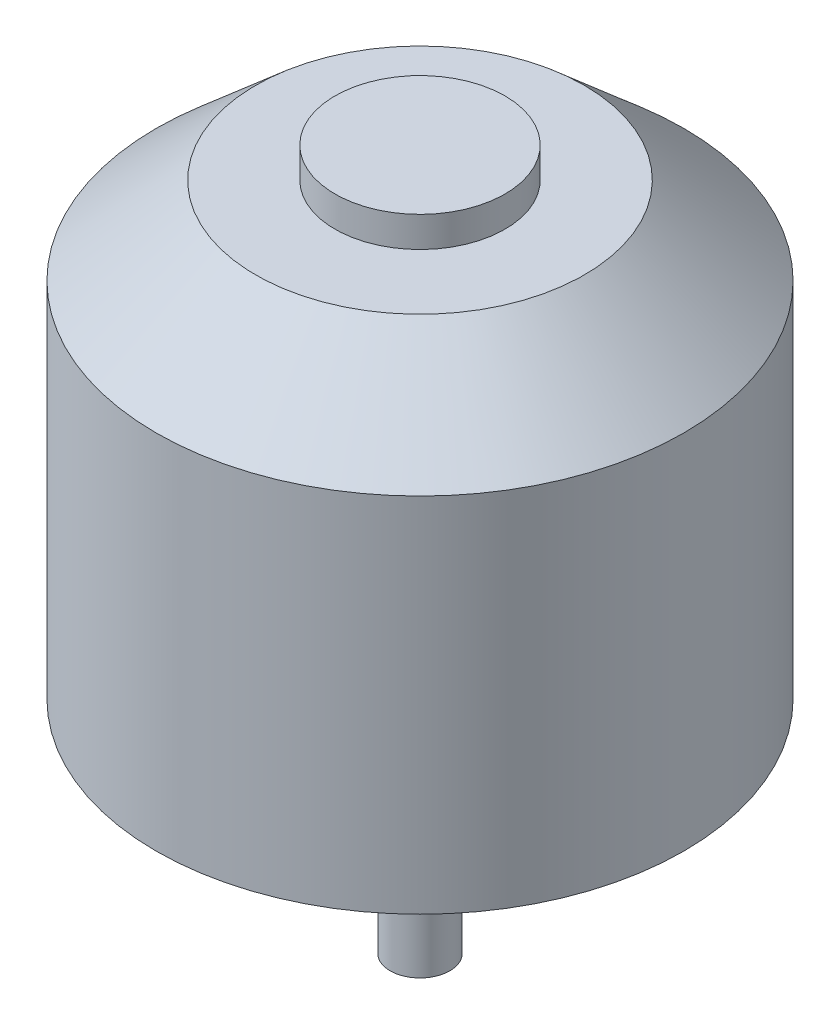
ISO-10303-21;
HEADER;
FILE_DESCRIPTION(('STEP AP214'),'2;1');
FILE_NAME('part.step','',(''),(''),'','','');
FILE_SCHEMA(('AUTOMOTIVE_DESIGN { 1 0 10303 214 1 1 1 1 }'));
ENDSEC;
DATA;
#1=APPLICATION_CONTEXT('core data for automotive mechanical design processes');
#2=APPLICATION_PROTOCOL_DEFINITION('international standard','automotive_design',2000,#1);
#3=PRODUCT_CONTEXT('',#1,'mechanical');
#4=PRODUCT('Part','Part','',(#3));
#5=PRODUCT_RELATED_PRODUCT_CATEGORY('part','',(#4));
#6=PRODUCT_DEFINITION_FORMATION('','',#4);
#7=PRODUCT_DEFINITION_CONTEXT('part definition',#1,'design');
#8=PRODUCT_DEFINITION('design','',#6,#7);
#9=PRODUCT_DEFINITION_SHAPE('','',#8);
#10=(LENGTH_UNIT() NAMED_UNIT(*) SI_UNIT(.MILLI.,.METRE.));
#11=(NAMED_UNIT(*) PLANE_ANGLE_UNIT() SI_UNIT($,.RADIAN.));
#12=(NAMED_UNIT(*) SI_UNIT($,.STERADIAN.) SOLID_ANGLE_UNIT());
#13=UNCERTAINTY_MEASURE_WITH_UNIT(LENGTH_MEASURE(1.E-05),#10,'distance_accuracy_value','');
#14=(GEOMETRIC_REPRESENTATION_CONTEXT(3) GLOBAL_UNCERTAINTY_ASSIGNED_CONTEXT((#13)) GLOBAL_UNIT_ASSIGNED_CONTEXT((#10,
#11,#12)) REPRESENTATION_CONTEXT('',''));
#15=CARTESIAN_POINT('',(0.,0.,0.));
#16=DIRECTION('',(0.,0.,1.));
#17=DIRECTION('',(1.,0.,0.));
#18=AXIS2_PLACEMENT_3D('',#15,#16,#17);
#19=CARTESIAN_POINT('',(0.,0.,0.));
#20=DIRECTION('',(0.,-1.,0.));
#21=DIRECTION('',(0.,0.,-1.));
#22=AXIS2_PLACEMENT_3D('',#19,#20,#21);
#23=PLANE('',#22);
#24=CARTESIAN_POINT('',(8.,0.,0.));
#25=DIRECTION('',(0.,-1.,0.));
#26=DIRECTION('',(0.,0.,-1.));
#27=AXIS2_PLACEMENT_3D('',#24,#25,#26);
#28=CIRCLE('',#27,1.25);
#29=CARTESIAN_POINT('',(8.,0.,-1.25));
#30=VERTEX_POINT('',#29);
#31=EDGE_CURVE('E64',#30,#30,#28,.T.);
#32=ORIENTED_EDGE('',*,*,#31,.F.);
#33=EDGE_LOOP('',(#32));
#34=FACE_BOUND('',#33,.T.);
#35=CARTESIAN_POINT('',(-8.,0.,0.));
#36=DIRECTION('',(0.,-1.,0.));
#37=DIRECTION('',(0.,0.,-1.));
#38=AXIS2_PLACEMENT_3D('',#35,#36,#37);
#39=CIRCLE('',#38,1.25);
#40=CARTESIAN_POINT('',(-8.,0.,-1.25));
#41=VERTEX_POINT('',#40);
#42=EDGE_CURVE('E63',#41,#41,#39,.T.);
#43=ORIENTED_EDGE('',*,*,#42,.F.);
#44=EDGE_LOOP('',(#43));
#45=FACE_BOUND('',#44,.T.);
#46=CARTESIAN_POINT('',(0.,0.,9.5));
#47=DIRECTION('',(0.,-1.,0.));
#48=DIRECTION('',(0.,0.,-1.));
#49=AXIS2_PLACEMENT_3D('',#46,#47,#48);
#50=CIRCLE('',#49,1.25);
#51=CARTESIAN_POINT('',(0.,0.,8.25));
#52=VERTEX_POINT('',#51);
#53=EDGE_CURVE('E74',#52,#52,#50,.T.);
#54=ORIENTED_EDGE('',*,*,#53,.F.);
#55=EDGE_LOOP('',(#54));
#56=FACE_BOUND('',#55,.T.);
#57=CARTESIAN_POINT('',(0.,0.,-9.5));
#58=DIRECTION('',(0.,-1.,0.));
#59=DIRECTION('',(0.,0.,-1.));
#60=AXIS2_PLACEMENT_3D('',#57,#58,#59);
#61=CIRCLE('',#60,1.25);
#62=CARTESIAN_POINT('',(0.,0.,-10.75));
#63=VERTEX_POINT('',#62);
#64=EDGE_CURVE('E80',#63,#63,#61,.T.);
#65=ORIENTED_EDGE('',*,*,#64,.F.);
#66=EDGE_LOOP('',(#65));
#67=FACE_BOUND('',#66,.T.);
#68=CARTESIAN_POINT('',(0.,0.,0.));
#69=DIRECTION('',(0.,-1.,0.));
#70=DIRECTION('',(0.,0.,-1.));
#71=AXIS2_PLACEMENT_3D('',#68,#69,#70);
#72=CIRCLE('',#71,13.97);
#73=CARTESIAN_POINT('',(0.,0.,-13.97));
#74=VERTEX_POINT('',#73);
#75=EDGE_CURVE('E11',#74,#74,#72,.T.);
#76=ORIENTED_EDGE('',*,*,#75,.T.);
#77=EDGE_LOOP('',(#76));
#78=FACE_BOUND('',#77,.T.);
#79=CARTESIAN_POINT('',(0.,0.,0.));
#80=DIRECTION('',(0.,-1.,0.));
#81=DIRECTION('',(0.,0.,-1.));
#82=AXIS2_PLACEMENT_3D('',#79,#80,#81);
#83=CIRCLE('',#82,1.58);
#84=CARTESIAN_POINT('',(0.,0.,-1.58));
#85=VERTEX_POINT('',#84);
#86=EDGE_CURVE('E86',#85,#85,#83,.T.);
#87=ORIENTED_EDGE('',*,*,#86,.F.);
#88=EDGE_LOOP('',(#87));
#89=FACE_BOUND('',#88,.T.);
#90=ADVANCED_FACE('F33',(#34,#45,#56,#67,#78,#89),#23,.T.);
#91=CARTESIAN_POINT('',(0.,0.,0.));
#92=DIRECTION('',(0.,-1.,0.));
#93=DIRECTION('',(0.,0.,-1.));
#94=AXIS2_PLACEMENT_3D('',#91,#92,#93);
#95=CYLINDRICAL_SURFACE('',#94,13.97);
#96=CARTESIAN_POINT('',(0.,19.177,0.));
#97=DIRECTION('',(0.,-1.,0.));
#98=DIRECTION('',(0.,0.,-1.));
#99=AXIS2_PLACEMENT_3D('',#96,#97,#98);
#100=CIRCLE('',#99,13.97);
#101=CARTESIAN_POINT('',(0.,19.177,-13.97));
#102=VERTEX_POINT('',#101);
#103=EDGE_CURVE('E40',#102,#102,#100,.T.);
#104=ORIENTED_EDGE('',*,*,#103,.T.);
#105=EDGE_LOOP('',(#104));
#106=FACE_BOUND('',#105,.T.);
#107=ORIENTED_EDGE('',*,*,#75,.F.);
#108=EDGE_LOOP('',(#107));
#109=FACE_BOUND('',#108,.T.);
#110=ADVANCED_FACE('F103',(#106,#109),#95,.T.);
#111=CARTESIAN_POINT('',(0.,19.177,0.));
#112=DIRECTION('',(0.,-1.,0.));
#113=DIRECTION('',(0.,0.,-1.));
#114=AXIS2_PLACEMENT_3D('',#111,#112,#113);
#115=CONICAL_SURFACE('',#114,13.97,0.85213694651985);
#116=CARTESIAN_POINT('',(0.,23.7871,0.));
#117=DIRECTION('',(0.,-1.,0.));
#118=DIRECTION('',(0.,0.,-1.));
#119=AXIS2_PLACEMENT_3D('',#116,#117,#118);
#120=CIRCLE('',#119,8.6995);
#121=CARTESIAN_POINT('',(0.,23.7871,-8.6995));
#122=VERTEX_POINT('',#121);
#123=EDGE_CURVE('E98',#122,#122,#120,.T.);
#124=ORIENTED_EDGE('',*,*,#123,.T.);
#125=EDGE_LOOP('',(#124));
#126=FACE_BOUND('',#125,.T.);
#127=ORIENTED_EDGE('',*,*,#103,.F.);
#128=EDGE_LOOP('',(#127));
#129=FACE_BOUND('',#128,.T.);
#130=ADVANCED_FACE('F106',(#126,#129),#115,.T.);
#131=CARTESIAN_POINT('',(8.6995,23.7871,0.));
#132=DIRECTION('',(0.,1.,0.));
#133=DIRECTION('',(0.,0.,1.));
#134=AXIS2_PLACEMENT_3D('',#131,#132,#133);
#135=PLANE('',#134);
#136=CARTESIAN_POINT('',(0.,23.7871,0.));
#137=DIRECTION('',(0.,-1.,0.));
#138=DIRECTION('',(0.,0.,-1.));
#139=AXIS2_PLACEMENT_3D('',#136,#137,#138);
#140=CIRCLE('',#139,4.50215);
#141=CARTESIAN_POINT('',(0.,23.7871,-4.50215));
#142=VERTEX_POINT('',#141);
#143=EDGE_CURVE('E95',#142,#142,#140,.T.);
#144=ORIENTED_EDGE('',*,*,#143,.T.);
#145=EDGE_LOOP('',(#144));
#146=FACE_BOUND('',#145,.T.);
#147=ORIENTED_EDGE('',*,*,#123,.F.);
#148=EDGE_LOOP('',(#147));
#149=FACE_BOUND('',#148,.T.);
#150=ADVANCED_FACE('F108',(#146,#149),#135,.T.);
#151=CARTESIAN_POINT('',(0.,0.,0.));
#152=DIRECTION('',(0.,-1.,0.));
#153=DIRECTION('',(0.,0.,-1.));
#154=AXIS2_PLACEMENT_3D('',#151,#152,#153);
#155=CYLINDRICAL_SURFACE('',#154,4.50215);
#156=CARTESIAN_POINT('',(0.,25.4,0.));
#157=DIRECTION('',(0.,-1.,0.));
#158=DIRECTION('',(0.,0.,-1.));
#159=AXIS2_PLACEMENT_3D('',#156,#157,#158);
#160=CIRCLE('',#159,4.50215);
#161=CARTESIAN_POINT('',(0.,25.4,-4.50215));
#162=VERTEX_POINT('',#161);
#163=EDGE_CURVE('E90',#162,#162,#160,.T.);
#164=ORIENTED_EDGE('',*,*,#163,.T.);
#165=EDGE_LOOP('',(#164));
#166=FACE_BOUND('',#165,.T.);
#167=ORIENTED_EDGE('',*,*,#143,.F.);
#168=EDGE_LOOP('',(#167));
#169=FACE_BOUND('',#168,.T.);
#170=ADVANCED_FACE('F115',(#166,#169),#155,.T.);
#171=CARTESIAN_POINT('',(4.50215,25.4,0.));
#172=DIRECTION('',(0.,1.,0.));
#173=DIRECTION('',(0.,0.,1.));
#174=AXIS2_PLACEMENT_3D('',#171,#172,#173);
#175=PLANE('',#174);
#176=ORIENTED_EDGE('',*,*,#163,.F.);
#177=EDGE_LOOP('',(#176));
#178=FACE_BOUND('',#177,.T.);
#179=ADVANCED_FACE('F137',(#178),#175,.T.);
#180=CARTESIAN_POINT('',(0.,-11.684,0.));
#181=DIRECTION('',(0.,1.,0.));
#182=DIRECTION('',(0.,0.,1.));
#183=AXIS2_PLACEMENT_3D('',#180,#181,#182);
#184=CYLINDRICAL_SURFACE('',#183,1.58);
#185=CARTESIAN_POINT('',(0.,-11.684,0.));
#186=DIRECTION('',(0.,-1.,0.));
#187=DIRECTION('',(0.,0.,-1.));
#188=AXIS2_PLACEMENT_3D('',#185,#186,#187);
#189=CIRCLE('',#188,1.58);
#190=CARTESIAN_POINT('',(0.,-11.684,-1.58));
#191=VERTEX_POINT('',#190);
#192=EDGE_CURVE('E87',#191,#191,#189,.T.);
#193=ORIENTED_EDGE('',*,*,#192,.F.);
#194=EDGE_LOOP('',(#193));
#195=FACE_BOUND('',#194,.T.);
#196=ORIENTED_EDGE('',*,*,#86,.T.);
#197=EDGE_LOOP('',(#196));
#198=FACE_BOUND('',#197,.T.);
#199=ADVANCED_FACE('F134',(#195,#198),#184,.T.);
#200=CARTESIAN_POINT('',(0.,-11.684,0.));
#201=DIRECTION('',(0.,-1.,0.));
#202=DIRECTION('',(0.,0.,-1.));
#203=AXIS2_PLACEMENT_3D('',#200,#201,#202);
#204=PLANE('',#203);
#205=ORIENTED_EDGE('',*,*,#192,.T.);
#206=EDGE_LOOP('',(#205));
#207=FACE_BOUND('',#206,.T.);
#208=ADVANCED_FACE('F136',(#207),#204,.T.);
#209=CARTESIAN_POINT('',(0.,3.175,-9.5));
#210=DIRECTION('',(0.,-1.,0.));
#211=DIRECTION('',(0.,0.,-1.));
#212=AXIS2_PLACEMENT_3D('',#209,#210,#211);
#213=CONICAL_SURFACE('',#212,1.25,1.02974425867665);
#214=CARTESIAN_POINT('',(0.,3.92607577378445,-9.5));
#215=VERTEX_POINT('',#214);
#216=VERTEX_LOOP('',#215);
#217=FACE_BOUND('',#216,.T.);
#218=CARTESIAN_POINT('',(0.,3.175,-9.5));
#219=DIRECTION('',(0.,-1.,0.));
#220=DIRECTION('',(0.,0.,-1.));
#221=AXIS2_PLACEMENT_3D('',#218,#219,#220);
#222=CIRCLE('',#221,1.25);
#223=CARTESIAN_POINT('',(0.,3.175,-10.75));
#224=VERTEX_POINT('',#223);
#225=EDGE_CURVE('E83',#224,#224,#222,.T.);
#226=ORIENTED_EDGE('',*,*,#225,.T.);
#227=EDGE_LOOP('',(#226));
#228=FACE_BOUND('',#227,.T.);
#229=ADVANCED_FACE('F144',(#217,#228),#213,.F.);
#230=CARTESIAN_POINT('',(0.,0.,-9.5));
#231=DIRECTION('',(0.,-1.,0.));
#232=DIRECTION('',(0.,0.,-1.));
#233=AXIS2_PLACEMENT_3D('',#230,#231,#232);
#234=CYLINDRICAL_SURFACE('',#233,1.25);
#235=ORIENTED_EDGE('',*,*,#225,.F.);
#236=EDGE_LOOP('',(#235));
#237=FACE_BOUND('',#236,.T.);
#238=ORIENTED_EDGE('',*,*,#64,.T.);
#239=EDGE_LOOP('',(#238));
#240=FACE_BOUND('',#239,.T.);
#241=ADVANCED_FACE('F190',(#237,#240),#234,.F.);
#242=CARTESIAN_POINT('',(0.,3.175,9.5));
#243=DIRECTION('',(0.,-1.,0.));
#244=DIRECTION('',(0.,0.,-1.));
#245=AXIS2_PLACEMENT_3D('',#242,#243,#244);
#246=CONICAL_SURFACE('',#245,1.25,1.02974425867665);
#247=CARTESIAN_POINT('',(0.,3.92607577378445,9.5));
#248=VERTEX_POINT('',#247);
#249=VERTEX_LOOP('',#248);
#250=FACE_BOUND('',#249,.T.);
#251=CARTESIAN_POINT('',(0.,3.175,9.5));
#252=DIRECTION('',(0.,-1.,0.));
#253=DIRECTION('',(0.,0.,-1.));
#254=AXIS2_PLACEMENT_3D('',#251,#252,#253);
#255=CIRCLE('',#254,1.25);
#256=CARTESIAN_POINT('',(0.,3.175,8.25));
#257=VERTEX_POINT('',#256);
#258=EDGE_CURVE('E77',#257,#257,#255,.T.);
#259=ORIENTED_EDGE('',*,*,#258,.T.);
#260=EDGE_LOOP('',(#259));
#261=FACE_BOUND('',#260,.T.);
#262=ADVANCED_FACE('F198',(#250,#261),#246,.F.);
#263=CARTESIAN_POINT('',(0.,0.,9.5));
#264=DIRECTION('',(0.,-1.,0.));
#265=DIRECTION('',(0.,0.,-1.));
#266=AXIS2_PLACEMENT_3D('',#263,#264,#265);
#267=CYLINDRICAL_SURFACE('',#266,1.25);
#268=ORIENTED_EDGE('',*,*,#258,.F.);
#269=EDGE_LOOP('',(#268));
#270=FACE_BOUND('',#269,.T.);
#271=ORIENTED_EDGE('',*,*,#53,.T.);
#272=EDGE_LOOP('',(#271));
#273=FACE_BOUND('',#272,.T.);
#274=ADVANCED_FACE('F208',(#270,#273),#267,.F.);
#275=CARTESIAN_POINT('',(-8.,3.175,0.));
#276=DIRECTION('',(0.,-1.,0.));
#277=DIRECTION('',(0.,0.,-1.));
#278=AXIS2_PLACEMENT_3D('',#275,#276,#277);
#279=CONICAL_SURFACE('',#278,1.25,1.02974425867665);
#280=CARTESIAN_POINT('',(-8.,3.92607577378445,0.));
#281=VERTEX_POINT('',#280);
#282=VERTEX_LOOP('',#281);
#283=FACE_BOUND('',#282,.T.);
#284=CARTESIAN_POINT('',(-8.,3.175,0.));
#285=DIRECTION('',(0.,-1.,0.));
#286=DIRECTION('',(0.,0.,-1.));
#287=AXIS2_PLACEMENT_3D('',#284,#285,#286);
#288=CIRCLE('',#287,1.25);
#289=CARTESIAN_POINT('',(-8.,3.175,-1.25));
#290=VERTEX_POINT('',#289);
#291=EDGE_CURVE('E67',#290,#290,#288,.T.);
#292=ORIENTED_EDGE('',*,*,#291,.T.);
#293=EDGE_LOOP('',(#292));
#294=FACE_BOUND('',#293,.T.);
#295=ADVANCED_FACE('F217',(#283,#294),#279,.F.);
#296=CARTESIAN_POINT('',(-8.,0.,0.));
#297=DIRECTION('',(0.,-1.,0.));
#298=DIRECTION('',(0.,0.,-1.));
#299=AXIS2_PLACEMENT_3D('',#296,#297,#298);
#300=CYLINDRICAL_SURFACE('',#299,1.25);
#301=ORIENTED_EDGE('',*,*,#291,.F.);
#302=EDGE_LOOP('',(#301));
#303=FACE_BOUND('',#302,.T.);
#304=ORIENTED_EDGE('',*,*,#42,.T.);
#305=EDGE_LOOP('',(#304));
#306=FACE_BOUND('',#305,.T.);
#307=ADVANCED_FACE('F57',(#303,#306),#300,.F.);
#308=CARTESIAN_POINT('',(8.,3.175,0.));
#309=DIRECTION('',(0.,-1.,0.));
#310=DIRECTION('',(0.,0.,-1.));
#311=AXIS2_PLACEMENT_3D('',#308,#309,#310);
#312=CONICAL_SURFACE('',#311,1.25,1.02974425867665);
#313=CARTESIAN_POINT('',(8.,3.92607577378445,0.));
#314=VERTEX_POINT('',#313);
#315=VERTEX_LOOP('',#314);
#316=FACE_BOUND('',#315,.T.);
#317=CARTESIAN_POINT('',(8.,3.175,0.));
#318=DIRECTION('',(0.,-1.,0.));
#319=DIRECTION('',(0.,0.,-1.));
#320=AXIS2_PLACEMENT_3D('',#317,#318,#319);
#321=CIRCLE('',#320,1.25);
#322=CARTESIAN_POINT('',(8.,3.175,-1.25));
#323=VERTEX_POINT('',#322);
#324=EDGE_CURVE('E61',#323,#323,#321,.T.);
#325=ORIENTED_EDGE('',*,*,#324,.T.);
#326=EDGE_LOOP('',(#325));
#327=FACE_BOUND('',#326,.T.);
#328=ADVANCED_FACE('F53',(#316,#327),#312,.F.);
#329=CARTESIAN_POINT('',(8.,0.,0.));
#330=DIRECTION('',(0.,-1.,0.));
#331=DIRECTION('',(0.,0.,-1.));
#332=AXIS2_PLACEMENT_3D('',#329,#330,#331);
#333=CYLINDRICAL_SURFACE('',#332,1.25);
#334=ORIENTED_EDGE('',*,*,#324,.F.);
#335=EDGE_LOOP('',(#334));
#336=FACE_BOUND('',#335,.T.);
#337=ORIENTED_EDGE('',*,*,#31,.T.);
#338=EDGE_LOOP('',(#337));
#339=FACE_BOUND('',#338,.T.);
#340=ADVANCED_FACE('F56',(#336,#339),#333,.F.);
#341=CLOSED_SHELL('',(#90,#110,#130,#150,#170,#179,#199,#208,#229,#241,#262,#274,#295,#307,#328,#340));
#342=MANIFOLD_SOLID_BREP('B2',#341);
#343=ADVANCED_BREP_SHAPE_REPRESENTATION('',(#18,#342),#14);
#344=SHAPE_DEFINITION_REPRESENTATION(#9,#343);
ENDSEC;
END-ISO-10303-21;
